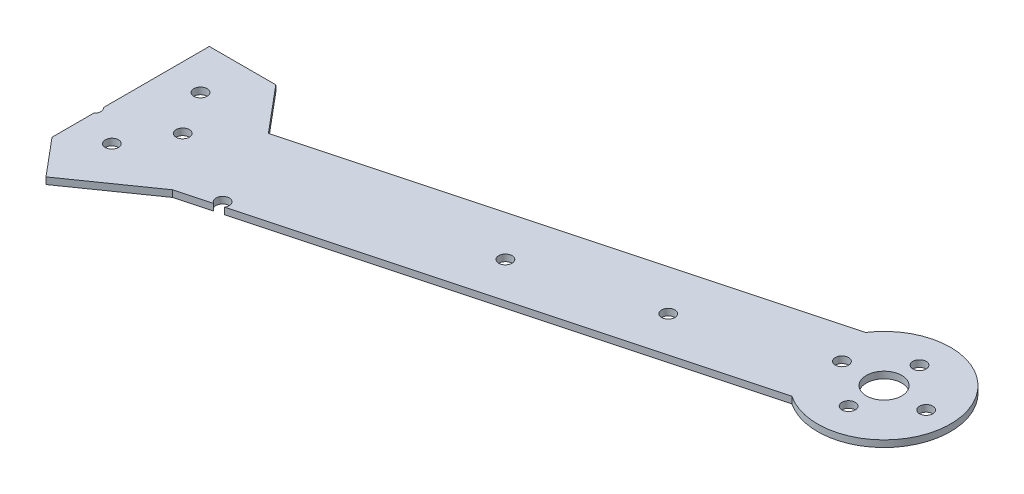
ISO-10303-21;
HEADER;
FILE_DESCRIPTION(('STEP AP214'),'2;1');
FILE_NAME('part.step','',(''),(''),'','','');
FILE_SCHEMA(('AUTOMOTIVE_DESIGN { 1 0 10303 214 1 1 1 1 }'));
ENDSEC;
DATA;
#1=APPLICATION_CONTEXT('core data for automotive mechanical design processes');
#2=APPLICATION_PROTOCOL_DEFINITION('international standard','automotive_design',2000,#1);
#3=PRODUCT_CONTEXT('',#1,'mechanical');
#4=PRODUCT('Part','Part','',(#3));
#5=PRODUCT_RELATED_PRODUCT_CATEGORY('part','',(#4));
#6=PRODUCT_DEFINITION_FORMATION('','',#4);
#7=PRODUCT_DEFINITION_CONTEXT('part definition',#1,'design');
#8=PRODUCT_DEFINITION('design','',#6,#7);
#9=PRODUCT_DEFINITION_SHAPE('','',#8);
#10=(LENGTH_UNIT() NAMED_UNIT(*) SI_UNIT(.MILLI.,.METRE.));
#11=(NAMED_UNIT(*) PLANE_ANGLE_UNIT() SI_UNIT($,.RADIAN.));
#12=(NAMED_UNIT(*) SI_UNIT($,.STERADIAN.) SOLID_ANGLE_UNIT());
#13=UNCERTAINTY_MEASURE_WITH_UNIT(LENGTH_MEASURE(1.E-05),#10,'distance_accuracy_value','');
#14=(GEOMETRIC_REPRESENTATION_CONTEXT(3) GLOBAL_UNCERTAINTY_ASSIGNED_CONTEXT((#13)) GLOBAL_UNIT_ASSIGNED_CONTEXT((#10,
#11,#12)) REPRESENTATION_CONTEXT('',''));
#15=CARTESIAN_POINT('',(0.,0.,0.));
#16=DIRECTION('',(0.,0.,1.));
#17=DIRECTION('',(1.,0.,0.));
#18=AXIS2_PLACEMENT_3D('',#15,#16,#17);
#19=CARTESIAN_POINT('',(0.765157013757434,1.5,2.85613868994704));
#20=DIRECTION('',(-0.258773909128812,0.,-0.965937919306512));
#21=DIRECTION('',(-0.965937919306512,0.,0.258773909128812));
#22=AXIS2_PLACEMENT_3D('',#19,#20,#21);
#23=PLANE('',#22);
#24=DIRECTION('',(0.965937919306512,0.,-0.258773909128812));
#25=VECTOR('',#24,1.);
#26=CARTESIAN_POINT('',(0.765157013757434,0.,2.85613868994704));
#27=LINE('',#26,#25);
#28=CARTESIAN_POINT('',(23.8632806144762,0.,-3.33182807088762));
#29=VERTEX_POINT('',#28);
#30=CARTESIAN_POINT('',(31.1943125351646,0.,-5.29580499957743));
#31=VERTEX_POINT('',#30);
#32=EDGE_CURVE('E215',#29,#31,#27,.T.);
#33=ORIENTED_EDGE('',*,*,#32,.T.);
#34=DIRECTION('',(0.,1.,0.));
#35=VECTOR('',#34,1.);
#36=CARTESIAN_POINT('',(31.1943125351646,-4.2426406871193,-5.29580499957743));
#37=LINE('',#36,#35);
#38=CARTESIAN_POINT('',(31.1943125351646,1.5,-5.29580499957743));
#39=VERTEX_POINT('',#38);
#40=EDGE_CURVE('E59',#31,#39,#37,.T.);
#41=ORIENTED_EDGE('',*,*,#40,.T.);
#42=DIRECTION('',(0.965937919306512,0.,-0.258773909128812));
#43=VECTOR('',#42,1.);
#44=CARTESIAN_POINT('',(0.765157013757434,1.5,2.85613868994704));
#45=LINE('',#44,#43);
#46=CARTESIAN_POINT('',(23.8632806144762,1.5,-3.33182807088762));
#47=VERTEX_POINT('',#46);
#48=EDGE_CURVE('E368',#47,#39,#45,.T.);
#49=ORIENTED_EDGE('',*,*,#48,.F.);
#50=DIRECTION('',(0.,-1.,0.));
#51=VECTOR('',#50,1.);
#52=CARTESIAN_POINT('',(23.8632806144762,1.5,-3.33182807088762));
#53=LINE('',#52,#51);
#54=EDGE_CURVE('E266',#47,#29,#53,.T.);
#55=ORIENTED_EDGE('',*,*,#54,.T.);
#56=EDGE_LOOP('',(#33,#41,#49,#55));
#57=FACE_BOUND('',#56,.T.);
#58=ADVANCED_FACE('F43',(#57),#23,.F.);
#59=CARTESIAN_POINT('',(-0.999999999999998,1.5,-10.5));
#60=DIRECTION('',(0.,-1.,0.));
#61=DIRECTION('',(0.,0.,-1.));
#62=AXIS2_PLACEMENT_3D('',#59,#60,#61);
#63=CYLINDRICAL_SURFACE('',#62,1.5);
#64=CARTESIAN_POINT('',(-0.999999999999998,0.,-10.5));
#65=DIRECTION('',(0.,1.,0.));
#66=DIRECTION('',(0.,0.,1.));
#67=AXIS2_PLACEMENT_3D('',#64,#65,#66);
#68=CIRCLE('',#67,1.5);
#69=CARTESIAN_POINT('',(0.,0.,-9.3819660112501));
#70=VERTEX_POINT('',#69);
#71=CARTESIAN_POINT('',(0.,0.,-11.6180339887499));
#72=VERTEX_POINT('',#71);
#73=EDGE_CURVE('E199',#70,#72,#68,.T.);
#74=ORIENTED_EDGE('',*,*,#73,.F.);
#75=DIRECTION('',(0.,-1.,0.));
#76=VECTOR('',#75,1.);
#77=CARTESIAN_POINT('',(0.,1.5,-9.3819660112501));
#78=LINE('',#77,#76);
#79=CARTESIAN_POINT('',(0.,1.5,-9.3819660112501));
#80=VERTEX_POINT('',#79);
#81=EDGE_CURVE('E11',#80,#70,#78,.T.);
#82=ORIENTED_EDGE('',*,*,#81,.F.);
#83=CARTESIAN_POINT('',(-0.999999999999998,1.5,-10.5));
#84=DIRECTION('',(0.,1.,0.));
#85=DIRECTION('',(0.,0.,1.));
#86=AXIS2_PLACEMENT_3D('',#83,#84,#85);
#87=CIRCLE('',#86,1.5);
#88=CARTESIAN_POINT('',(0.,1.5,-11.6180339887499));
#89=VERTEX_POINT('',#88);
#90=EDGE_CURVE('E357',#80,#89,#87,.T.);
#91=ORIENTED_EDGE('',*,*,#90,.T.);
#92=DIRECTION('',(0.,-1.,0.));
#93=VECTOR('',#92,1.);
#94=CARTESIAN_POINT('',(0.,1.5,-11.6180339887499));
#95=LINE('',#94,#93);
#96=EDGE_CURVE('E68',#89,#72,#95,.T.);
#97=ORIENTED_EDGE('',*,*,#96,.T.);
#98=EDGE_LOOP('',(#74,#82,#91,#97));
#99=FACE_BOUND('',#98,.T.);
#100=ADVANCED_FACE('F291',(#99),#63,.F.);
#101=CARTESIAN_POINT('',(0.,1.5,0.));
#102=DIRECTION('',(-1.,0.,0.));
#103=DIRECTION('',(0.,0.,1.));
#104=AXIS2_PLACEMENT_3D('',#101,#102,#103);
#105=PLANE('',#104);
#106=DIRECTION('',(0.,0.,-1.));
#107=VECTOR('',#106,1.);
#108=CARTESIAN_POINT('',(0.,0.,0.));
#109=LINE('',#108,#107);
#110=CARTESIAN_POINT('',(0.,0.,0.));
#111=VERTEX_POINT('',#110);
#112=EDGE_CURVE('E202',#111,#70,#109,.T.);
#113=ORIENTED_EDGE('',*,*,#112,.F.);
#114=DIRECTION('',(0.,-1.,0.));
#115=VECTOR('',#114,1.);
#116=CARTESIAN_POINT('',(0.,1.5,0.));
#117=LINE('',#116,#115);
#118=CARTESIAN_POINT('',(0.,1.5,0.));
#119=VERTEX_POINT('',#118);
#120=EDGE_CURVE('E52',#119,#111,#117,.T.);
#121=ORIENTED_EDGE('',*,*,#120,.F.);
#122=DIRECTION('',(0.,0.,-1.));
#123=VECTOR('',#122,1.);
#124=CARTESIAN_POINT('',(0.,1.5,0.));
#125=LINE('',#124,#123);
#126=EDGE_CURVE('E290',#119,#80,#125,.T.);
#127=ORIENTED_EDGE('',*,*,#126,.T.);
#128=ORIENTED_EDGE('',*,*,#81,.T.);
#129=EDGE_LOOP('',(#113,#121,#127,#128));
#130=FACE_BOUND('',#129,.T.);
#131=ADVANCED_FACE('F289',(#130),#105,.T.);
#132=CARTESIAN_POINT('',(0.,1.5,0.));
#133=DIRECTION('',(0.766044443118982,0.,-0.642787609686535));
#134=DIRECTION('',(-0.642787609686535,0.,-0.766044443118982));
#135=AXIS2_PLACEMENT_3D('',#132,#133,#134);
#136=PLANE('',#135);
#137=DIRECTION('',(0.642787609686535,0.,0.766044443118982));
#138=VECTOR('',#137,1.);
#139=CARTESIAN_POINT('',(0.,0.,0.));
#140=LINE('',#139,#138);
#141=CARTESIAN_POINT('',(7.07066370655189,0.,8.4264888743088));
#142=VERTEX_POINT('',#141);
#143=EDGE_CURVE('E206',#111,#142,#140,.T.);
#144=ORIENTED_EDGE('',*,*,#143,.T.);
#145=DIRECTION('',(0.,-1.,0.));
#146=VECTOR('',#145,1.);
#147=CARTESIAN_POINT('',(7.07066370655189,1.5,8.4264888743088));
#148=LINE('',#147,#146);
#149=CARTESIAN_POINT('',(7.07066370655189,1.5,8.4264888743088));
#150=VERTEX_POINT('',#149);
#151=EDGE_CURVE('E270',#150,#142,#148,.T.);
#152=ORIENTED_EDGE('',*,*,#151,.F.);
#153=DIRECTION('',(0.642787609686535,0.,0.766044443118982));
#154=VECTOR('',#153,1.);
#155=CARTESIAN_POINT('',(0.,1.5,0.));
#156=LINE('',#155,#154);
#157=EDGE_CURVE('E280',#119,#150,#156,.T.);
#158=ORIENTED_EDGE('',*,*,#157,.F.);
#159=ORIENTED_EDGE('',*,*,#120,.T.);
#160=EDGE_LOOP('',(#144,#152,#158,#159));
#161=FACE_BOUND('',#160,.T.);
#162=ADVANCED_FACE('F277',(#161),#136,.F.);
#163=CARTESIAN_POINT('',(6.28533185327595,1.5,8.97638415796881));
#164=DIRECTION('',(-0.573576436351045,0.,-0.819152044288993));
#165=DIRECTION('',(-0.819152044288993,0.,0.573576436351045));
#166=AXIS2_PLACEMENT_3D('',#163,#164,#165);
#167=PLANE('',#166);
#168=DIRECTION('',(0.819152044288993,0.,-0.573576436351045));
#169=VECTOR('',#168,1.);
#170=CARTESIAN_POINT('',(6.28533185327595,0.,8.97638415796881));
#171=LINE('',#170,#169);
#172=EDGE_CURVE('E210',#142,#29,#171,.T.);
#173=ORIENTED_EDGE('',*,*,#172,.T.);
#174=ORIENTED_EDGE('',*,*,#54,.F.);
#175=DIRECTION('',(0.819152044288993,0.,-0.573576436351045));
#176=VECTOR('',#175,1.);
#177=CARTESIAN_POINT('',(6.28533185327595,1.5,8.97638415796881));
#178=LINE('',#177,#176);
#179=EDGE_CURVE('E364',#150,#47,#178,.T.);
#180=ORIENTED_EDGE('',*,*,#179,.F.);
#181=ORIENTED_EDGE('',*,*,#151,.T.);
#182=EDGE_LOOP('',(#173,#174,#180,#181));
#183=FACE_BOUND('',#182,.T.);
#184=ADVANCED_FACE('F380',(#183),#167,.F.);
#185=CARTESIAN_POINT('',(33.1085220639019,1.5,-5.80862002913812));
#186=VERTEX_POINT('',#185);
#187=CARTESIAN_POINT('',(134.097880355283,1.5,-32.8635792590577));
#188=VERTEX_POINT('',#187);
#189=EDGE_CURVE('E308',#186,#188,#45,.T.);
#190=ORIENTED_EDGE('',*,*,#189,.F.);
#191=DIRECTION('',(0.,1.,0.));
#192=VECTOR('',#191,1.);
#193=CARTESIAN_POINT('',(33.1085220639018,-4.2426406871193,-5.80862002913812));
#194=LINE('',#193,#192);
#195=CARTESIAN_POINT('',(33.1085220639019,0.,-5.80862002913812));
#196=VERTEX_POINT('',#195);
#197=EDGE_CURVE('E311',#186,#196,#194,.F.);
#198=ORIENTED_EDGE('',*,*,#197,.T.);
#199=CARTESIAN_POINT('',(134.097880355283,0.,-32.8635792590577));
#200=VERTEX_POINT('',#199);
#201=EDGE_CURVE('E214',#196,#200,#27,.T.);
#202=ORIENTED_EDGE('',*,*,#201,.T.);
#203=DIRECTION('',(0.,-1.,0.));
#204=VECTOR('',#203,1.);
#205=CARTESIAN_POINT('',(134.097880355283,1.5,-32.8635792590577));
#206=LINE('',#205,#204);
#207=EDGE_CURVE('E262',#188,#200,#206,.T.);
#208=ORIENTED_EDGE('',*,*,#207,.F.);
#209=EDGE_LOOP('',(#190,#198,#202,#208));
#210=FACE_BOUND('',#209,.T.);
#211=ADVANCED_FACE('F305',(#210),#23,.F.);
#212=CARTESIAN_POINT('',(142.429473622566,1.5,-45.3369330032826));
#213=DIRECTION('',(0.,-1.,0.));
#214=DIRECTION('',(0.,0.,-1.));
#215=AXIS2_PLACEMENT_3D('',#212,#213,#214);
#216=CYLINDRICAL_SURFACE('',#215,15.);
#217=CARTESIAN_POINT('',(142.429473622566,0.,-45.3369330032826));
#218=DIRECTION('',(0.,1.,0.));
#219=DIRECTION('',(0.,0.,1.));
#220=AXIS2_PLACEMENT_3D('',#217,#218,#219);
#221=CIRCLE('',#220,15.);
#222=CARTESIAN_POINT('',(129.929473622566,0.,-53.6284949791711));
#223=VERTEX_POINT('',#222);
#224=EDGE_CURVE('E219',#200,#223,#221,.T.);
#225=ORIENTED_EDGE('',*,*,#224,.T.);
#226=DIRECTION('',(0.,-1.,0.));
#227=VECTOR('',#226,1.);
#228=CARTESIAN_POINT('',(129.929473622566,1.5,-53.6284949791711));
#229=LINE('',#228,#227);
#230=CARTESIAN_POINT('',(129.929473622566,1.5,-53.6284949791711));
#231=VERTEX_POINT('',#230);
#232=EDGE_CURVE('E259',#231,#223,#229,.T.);
#233=ORIENTED_EDGE('',*,*,#232,.F.);
#234=CARTESIAN_POINT('',(142.429473622566,1.5,-45.3369330032826));
#235=DIRECTION('',(0.,1.,0.));
#236=DIRECTION('',(0.,0.,1.));
#237=AXIS2_PLACEMENT_3D('',#234,#235,#236);
#238=CIRCLE('',#237,15.);
#239=EDGE_CURVE('E302',#188,#231,#238,.T.);
#240=ORIENTED_EDGE('',*,*,#239,.F.);
#241=ORIENTED_EDGE('',*,*,#207,.T.);
#242=EDGE_LOOP('',(#225,#233,#240,#241));
#243=FACE_BOUND('',#242,.T.);
#244=ADVANCED_FACE('F300',(#243),#216,.T.);
#245=CARTESIAN_POINT('',(-4.70349936225093,1.5,-17.5536985932882));
#246=DIRECTION('',(-0.258819045102521,0.,-0.965925826289068));
#247=DIRECTION('',(-0.965925826289068,0.,0.258819045102521));
#248=AXIS2_PLACEMENT_3D('',#245,#246,#247);
#249=PLANE('',#248);
#250=DIRECTION('',(0.965925826289068,0.,-0.258819045102521));
#251=VECTOR('',#250,1.);
#252=CARTESIAN_POINT('',(-4.70349936225093,0.,-17.5536985932882));
#253=LINE('',#252,#251);
#254=CARTESIAN_POINT('',(23.6776327307683,0.,-25.1584000178938));
#255=VERTEX_POINT('',#254);
#256=EDGE_CURVE('E223',#255,#223,#253,.T.);
#257=ORIENTED_EDGE('',*,*,#256,.F.);
#258=DIRECTION('',(0.,-1.,0.));
#259=VECTOR('',#258,1.);
#260=CARTESIAN_POINT('',(23.6776327307683,1.5,-25.1584000178938));
#261=LINE('',#260,#259);
#262=CARTESIAN_POINT('',(23.6776327307683,1.5,-25.1584000178938));
#263=VERTEX_POINT('',#262);
#264=EDGE_CURVE('E144',#263,#255,#261,.T.);
#265=ORIENTED_EDGE('',*,*,#264,.F.);
#266=DIRECTION('',(0.965925826289068,0.,-0.258819045102521));
#267=VECTOR('',#266,1.);
#268=CARTESIAN_POINT('',(-4.70349936225093,1.5,-17.5536985932882));
#269=LINE('',#268,#267);
#270=EDGE_CURVE('E156',#263,#231,#269,.T.);
#271=ORIENTED_EDGE('',*,*,#270,.T.);
#272=ORIENTED_EDGE('',*,*,#232,.T.);
#273=EDGE_LOOP('',(#257,#265,#271,#272));
#274=FACE_BOUND('',#273,.T.);
#275=ADVANCED_FACE('F296',(#274),#249,.T.);
#276=CARTESIAN_POINT('',(26.2826989484687,1.5,-22.0538029940035));
#277=DIRECTION('',(0.76604444311898,0.,-0.642787609686537));
#278=DIRECTION('',(-0.642787609686537,0.,-0.76604444311898));
#279=AXIS2_PLACEMENT_3D('',#276,#277,#278);
#280=PLANE('',#279);
#281=DIRECTION('',(0.642787609686537,0.,0.76604444311898));
#282=VECTOR('',#281,1.);
#283=CARTESIAN_POINT('',(26.2826989484687,0.,-22.0538029940035));
#284=LINE('',#283,#282);
#285=CARTESIAN_POINT('',(15.,0.,-35.5));
#286=VERTEX_POINT('',#285);
#287=EDGE_CURVE('E138',#286,#255,#284,.T.);
#288=ORIENTED_EDGE('',*,*,#287,.F.);
#289=DIRECTION('',(0.,-1.,0.));
#290=VECTOR('',#289,1.);
#291=CARTESIAN_POINT('',(15.,1.5,-35.5));
#292=LINE('',#291,#290);
#293=CARTESIAN_POINT('',(15.,1.5,-35.5));
#294=VERTEX_POINT('',#293);
#295=EDGE_CURVE('E133',#294,#286,#292,.T.);
#296=ORIENTED_EDGE('',*,*,#295,.F.);
#297=DIRECTION('',(0.642787609686537,0.,0.76604444311898));
#298=VECTOR('',#297,1.);
#299=CARTESIAN_POINT('',(26.2826989484687,1.5,-22.0538029940035));
#300=LINE('',#299,#298);
#301=EDGE_CURVE('E136',#294,#263,#300,.T.);
#302=ORIENTED_EDGE('',*,*,#301,.T.);
#303=ORIENTED_EDGE('',*,*,#264,.T.);
#304=EDGE_LOOP('',(#288,#296,#302,#303));
#305=FACE_BOUND('',#304,.T.);
#306=ADVANCED_FACE('F135',(#305),#280,.T.);
#307=CARTESIAN_POINT('',(0.,1.5,-35.5));
#308=DIRECTION('',(0.,0.,-1.));
#309=DIRECTION('',(-1.,0.,0.));
#310=AXIS2_PLACEMENT_3D('',#307,#308,#309);
#311=PLANE('',#310);
#312=DIRECTION('',(1.,0.,0.));
#313=VECTOR('',#312,1.);
#314=CARTESIAN_POINT('',(0.,0.,-35.5));
#315=LINE('',#314,#313);
#316=CARTESIAN_POINT('',(0.,0.,-35.5));
#317=VERTEX_POINT('',#316);
#318=EDGE_CURVE('E229',#317,#286,#315,.T.);
#319=ORIENTED_EDGE('',*,*,#318,.F.);
#320=DIRECTION('',(0.,-1.,0.));
#321=VECTOR('',#320,1.);
#322=CARTESIAN_POINT('',(0.,1.5,-35.5));
#323=LINE('',#322,#321);
#324=CARTESIAN_POINT('',(0.,1.5,-35.5));
#325=VERTEX_POINT('',#324);
#326=EDGE_CURVE('E145',#325,#317,#323,.T.);
#327=ORIENTED_EDGE('',*,*,#326,.F.);
#328=DIRECTION('',(1.,0.,0.));
#329=VECTOR('',#328,1.);
#330=CARTESIAN_POINT('',(0.,1.5,-35.5));
#331=LINE('',#330,#329);
#332=EDGE_CURVE('E154',#325,#294,#331,.T.);
#333=ORIENTED_EDGE('',*,*,#332,.T.);
#334=ORIENTED_EDGE('',*,*,#295,.T.);
#335=EDGE_LOOP('',(#319,#327,#333,#334));
#336=FACE_BOUND('',#335,.T.);
#337=ADVANCED_FACE('F159',(#336),#311,.T.);
#338=CARTESIAN_POINT('',(8.,1.5,-25.5));
#339=DIRECTION('',(0.,-1.,0.));
#340=DIRECTION('',(0.,0.,-1.));
#341=AXIS2_PLACEMENT_3D('',#338,#339,#340);
#342=CYLINDRICAL_SURFACE('',#341,1.5);
#343=CARTESIAN_POINT('',(8.,1.5,-25.5));
#344=DIRECTION('',(0.,1.,0.));
#345=DIRECTION('',(0.,0.,1.));
#346=AXIS2_PLACEMENT_3D('',#343,#344,#345);
#347=CIRCLE('',#346,1.5);
#348=CARTESIAN_POINT('',(8.,1.5,-24.));
#349=VERTEX_POINT('',#348);
#350=EDGE_CURVE('E175',#349,#349,#347,.T.);
#351=ORIENTED_EDGE('',*,*,#350,.T.);
#352=EDGE_LOOP('',(#351));
#353=FACE_BOUND('',#352,.T.);
#354=CARTESIAN_POINT('',(8.,0.,-25.5));
#355=DIRECTION('',(0.,1.,0.));
#356=DIRECTION('',(0.,0.,1.));
#357=AXIS2_PLACEMENT_3D('',#354,#355,#356);
#358=CIRCLE('',#357,1.5);
#359=CARTESIAN_POINT('',(8.,0.,-24.));
#360=VERTEX_POINT('',#359);
#361=EDGE_CURVE('E244',#360,#360,#358,.T.);
#362=ORIENTED_EDGE('',*,*,#361,.F.);
#363=EDGE_LOOP('',(#362));
#364=FACE_BOUND('',#363,.T.);
#365=ADVANCED_FACE('F403',(#353,#364),#342,.F.);
#366=CARTESIAN_POINT('',(14.,1.5,-15.5));
#367=DIRECTION('',(0.,-1.,0.));
#368=DIRECTION('',(0.,0.,-1.));
#369=AXIS2_PLACEMENT_3D('',#366,#367,#368);
#370=CYLINDRICAL_SURFACE('',#369,1.5);
#371=CARTESIAN_POINT('',(14.,1.5,-15.5));
#372=DIRECTION('',(0.,1.,0.));
#373=DIRECTION('',(0.,0.,1.));
#374=AXIS2_PLACEMENT_3D('',#371,#372,#373);
#375=CIRCLE('',#374,1.5);
#376=CARTESIAN_POINT('',(14.,1.5,-14.));
#377=VERTEX_POINT('',#376);
#378=EDGE_CURVE('E171',#377,#377,#375,.T.);
#379=ORIENTED_EDGE('',*,*,#378,.T.);
#380=EDGE_LOOP('',(#379));
#381=FACE_BOUND('',#380,.T.);
#382=CARTESIAN_POINT('',(14.,0.,-15.5));
#383=DIRECTION('',(0.,1.,0.));
#384=DIRECTION('',(0.,0.,1.));
#385=AXIS2_PLACEMENT_3D('',#382,#383,#384);
#386=CIRCLE('',#385,1.5);
#387=CARTESIAN_POINT('',(14.,0.,-14.));
#388=VERTEX_POINT('',#387);
#389=EDGE_CURVE('E240',#388,#388,#386,.T.);
#390=ORIENTED_EDGE('',*,*,#389,.F.);
#391=EDGE_LOOP('',(#390));
#392=FACE_BOUND('',#391,.T.);
#393=ADVANCED_FACE('F410',(#381,#392),#370,.F.);
#394=CARTESIAN_POINT('',(8.,1.5,-5.5));
#395=DIRECTION('',(0.,-1.,0.));
#396=DIRECTION('',(0.,0.,-1.));
#397=AXIS2_PLACEMENT_3D('',#394,#395,#396);
#398=CYLINDRICAL_SURFACE('',#397,1.5);
#399=CARTESIAN_POINT('',(8.,1.5,-5.5));
#400=DIRECTION('',(0.,1.,0.));
#401=DIRECTION('',(0.,0.,1.));
#402=AXIS2_PLACEMENT_3D('',#399,#400,#401);
#403=CIRCLE('',#402,1.5);
#404=CARTESIAN_POINT('',(8.,1.5,-4.));
#405=VERTEX_POINT('',#404);
#406=EDGE_CURVE('E164',#405,#405,#403,.T.);
#407=ORIENTED_EDGE('',*,*,#406,.T.);
#408=EDGE_LOOP('',(#407));
#409=FACE_BOUND('',#408,.T.);
#410=CARTESIAN_POINT('',(8.,0.,-5.5));
#411=DIRECTION('',(0.,1.,0.));
#412=DIRECTION('',(0.,0.,1.));
#413=AXIS2_PLACEMENT_3D('',#410,#411,#412);
#414=CIRCLE('',#413,1.5);
#415=CARTESIAN_POINT('',(8.,0.,-4.));
#416=VERTEX_POINT('',#415);
#417=EDGE_CURVE('E236',#416,#416,#414,.T.);
#418=ORIENTED_EDGE('',*,*,#417,.F.);
#419=EDGE_LOOP('',(#418));
#420=FACE_BOUND('',#419,.T.);
#421=ADVANCED_FACE('F407',(#409,#420),#398,.F.);
#422=CARTESIAN_POINT('',(0.,1.5,0.));
#423=DIRECTION('',(-1.,0.,0.));
#424=DIRECTION('',(0.,0.,1.));
#425=AXIS2_PLACEMENT_3D('',#422,#423,#424);
#426=PLANE('',#425);
#427=DIRECTION('',(0.,0.,-1.));
#428=VECTOR('',#427,1.);
#429=CARTESIAN_POINT('',(0.,0.,0.));
#430=LINE('',#429,#428);
#431=EDGE_CURVE('E232',#72,#317,#430,.T.);
#432=ORIENTED_EDGE('',*,*,#431,.F.);
#433=ORIENTED_EDGE('',*,*,#96,.F.);
#434=DIRECTION('',(0.,0.,-1.));
#435=VECTOR('',#434,1.);
#436=CARTESIAN_POINT('',(0.,1.5,0.));
#437=LINE('',#436,#435);
#438=EDGE_CURVE('E161',#89,#325,#437,.T.);
#439=ORIENTED_EDGE('',*,*,#438,.T.);
#440=ORIENTED_EDGE('',*,*,#326,.T.);
#441=EDGE_LOOP('',(#432,#433,#439,#440));
#442=FACE_BOUND('',#441,.T.);
#443=ADVANCED_FACE('F292',(#442),#426,.T.);
#444=CARTESIAN_POINT('',(142.429473622566,1.5,-53.3369330032827));
#445=DIRECTION('',(0.,-1.,0.));
#446=DIRECTION('',(0.,0.,-1.));
#447=AXIS2_PLACEMENT_3D('',#444,#445,#446);
#448=CYLINDRICAL_SURFACE('',#447,1.5);
#449=CARTESIAN_POINT('',(142.429473622566,1.5,-53.3369330032827));
#450=DIRECTION('',(0.,1.,0.));
#451=DIRECTION('',(0.,0.,1.));
#452=AXIS2_PLACEMENT_3D('',#449,#450,#451);
#453=CIRCLE('',#452,1.5);
#454=CARTESIAN_POINT('',(142.429473622566,1.5,-51.8369330032827));
#455=VERTEX_POINT('',#454);
#456=EDGE_CURVE('E353',#455,#455,#453,.T.);
#457=ORIENTED_EDGE('',*,*,#456,.T.);
#458=EDGE_LOOP('',(#457));
#459=FACE_BOUND('',#458,.T.);
#460=CARTESIAN_POINT('',(142.429473622566,0.,-53.3369330032827));
#461=DIRECTION('',(0.,1.,0.));
#462=DIRECTION('',(0.,0.,1.));
#463=AXIS2_PLACEMENT_3D('',#460,#461,#462);
#464=CIRCLE('',#463,1.5);
#465=CARTESIAN_POINT('',(142.429473622566,0.,-51.8369330032827));
#466=VERTEX_POINT('',#465);
#467=EDGE_CURVE('E195',#466,#466,#464,.T.);
#468=ORIENTED_EDGE('',*,*,#467,.F.);
#469=EDGE_LOOP('',(#468));
#470=FACE_BOUND('',#469,.T.);
#471=ADVANCED_FACE('F406',(#459,#470),#448,.F.);
#472=CARTESIAN_POINT('',(151.929473622566,1.5,-45.3369330032826));
#473=DIRECTION('',(0.,-1.,0.));
#474=DIRECTION('',(0.,0.,-1.));
#475=AXIS2_PLACEMENT_3D('',#472,#473,#474);
#476=CYLINDRICAL_SURFACE('',#475,1.5);
#477=CARTESIAN_POINT('',(151.929473622566,1.5,-45.3369330032826));
#478=DIRECTION('',(0.,1.,0.));
#479=DIRECTION('',(0.,0.,1.));
#480=AXIS2_PLACEMENT_3D('',#477,#478,#479);
#481=CIRCLE('',#480,1.5);
#482=CARTESIAN_POINT('',(151.929473622566,1.5,-43.8369330032826));
#483=VERTEX_POINT('',#482);
#484=EDGE_CURVE('E349',#483,#483,#481,.T.);
#485=ORIENTED_EDGE('',*,*,#484,.T.);
#486=EDGE_LOOP('',(#485));
#487=FACE_BOUND('',#486,.T.);
#488=CARTESIAN_POINT('',(151.929473622566,0.,-45.3369330032826));
#489=DIRECTION('',(0.,1.,0.));
#490=DIRECTION('',(0.,0.,1.));
#491=AXIS2_PLACEMENT_3D('',#488,#489,#490);
#492=CIRCLE('',#491,1.5);
#493=CARTESIAN_POINT('',(151.929473622566,0.,-43.8369330032826));
#494=VERTEX_POINT('',#493);
#495=EDGE_CURVE('E191',#494,#494,#492,.T.);
#496=ORIENTED_EDGE('',*,*,#495,.F.);
#497=EDGE_LOOP('',(#496));
#498=FACE_BOUND('',#497,.T.);
#499=ADVANCED_FACE('F455',(#487,#498),#476,.F.);
#500=CARTESIAN_POINT('',(142.429473622566,1.5,-37.3369330032827));
#501=DIRECTION('',(0.,-1.,0.));
#502=DIRECTION('',(0.,0.,-1.));
#503=AXIS2_PLACEMENT_3D('',#500,#501,#502);
#504=CYLINDRICAL_SURFACE('',#503,1.5);
#505=CARTESIAN_POINT('',(142.429473622566,1.5,-37.3369330032827));
#506=DIRECTION('',(0.,1.,0.));
#507=DIRECTION('',(0.,0.,1.));
#508=AXIS2_PLACEMENT_3D('',#505,#506,#507);
#509=CIRCLE('',#508,1.5);
#510=CARTESIAN_POINT('',(142.429473622566,1.5,-35.8369330032827));
#511=VERTEX_POINT('',#510);
#512=EDGE_CURVE('E345',#511,#511,#509,.T.);
#513=ORIENTED_EDGE('',*,*,#512,.T.);
#514=EDGE_LOOP('',(#513));
#515=FACE_BOUND('',#514,.T.);
#516=CARTESIAN_POINT('',(142.429473622566,0.,-37.3369330032827));
#517=DIRECTION('',(0.,1.,0.));
#518=DIRECTION('',(0.,0.,1.));
#519=AXIS2_PLACEMENT_3D('',#516,#517,#518);
#520=CIRCLE('',#519,1.5);
#521=CARTESIAN_POINT('',(142.429473622566,0.,-35.8369330032827));
#522=VERTEX_POINT('',#521);
#523=EDGE_CURVE('E187',#522,#522,#520,.T.);
#524=ORIENTED_EDGE('',*,*,#523,.F.);
#525=EDGE_LOOP('',(#524));
#526=FACE_BOUND('',#525,.T.);
#527=ADVANCED_FACE('F461',(#515,#526),#504,.F.);
#528=CARTESIAN_POINT('',(132.929473622566,1.5,-45.3369330032826));
#529=DIRECTION('',(0.,-1.,0.));
#530=DIRECTION('',(0.,0.,-1.));
#531=AXIS2_PLACEMENT_3D('',#528,#529,#530);
#532=CYLINDRICAL_SURFACE('',#531,1.5);
#533=CARTESIAN_POINT('',(132.929473622566,1.5,-45.3369330032826));
#534=DIRECTION('',(0.,1.,0.));
#535=DIRECTION('',(0.,0.,1.));
#536=AXIS2_PLACEMENT_3D('',#533,#534,#535);
#537=CIRCLE('',#536,1.5);
#538=CARTESIAN_POINT('',(132.929473622566,1.5,-43.8369330032826));
#539=VERTEX_POINT('',#538);
#540=EDGE_CURVE('E252',#539,#539,#537,.T.);
#541=ORIENTED_EDGE('',*,*,#540,.T.);
#542=EDGE_LOOP('',(#541));
#543=FACE_BOUND('',#542,.T.);
#544=CARTESIAN_POINT('',(132.929473622566,0.,-45.3369330032826));
#545=DIRECTION('',(0.,1.,0.));
#546=DIRECTION('',(0.,0.,1.));
#547=AXIS2_PLACEMENT_3D('',#544,#545,#546);
#548=CIRCLE('',#547,1.5);
#549=CARTESIAN_POINT('',(132.929473622566,0.,-43.8369330032826));
#550=VERTEX_POINT('',#549);
#551=EDGE_CURVE('E183',#550,#550,#548,.T.);
#552=ORIENTED_EDGE('',*,*,#551,.F.);
#553=EDGE_LOOP('',(#552));
#554=FACE_BOUND('',#553,.T.);
#555=ADVANCED_FACE('F45',(#543,#554),#532,.F.);
#556=CARTESIAN_POINT('',(142.429473622566,1.5,-45.3369330032826));
#557=DIRECTION('',(0.,-1.,0.));
#558=DIRECTION('',(0.,0.,-1.));
#559=AXIS2_PLACEMENT_3D('',#556,#557,#558);
#560=CYLINDRICAL_SURFACE('',#559,4.00000000000002);
#561=CARTESIAN_POINT('',(142.429473622566,1.5,-45.3369330032826));
#562=DIRECTION('',(0.,1.,0.));
#563=DIRECTION('',(0.,0.,1.));
#564=AXIS2_PLACEMENT_3D('',#561,#562,#563);
#565=CIRCLE('',#564,4.00000000000002);
#566=CARTESIAN_POINT('',(142.429473622566,1.5,-41.3369330032826));
#567=VERTEX_POINT('',#566);
#568=EDGE_CURVE('E179',#567,#567,#565,.T.);
#569=ORIENTED_EDGE('',*,*,#568,.T.);
#570=EDGE_LOOP('',(#569));
#571=FACE_BOUND('',#570,.T.);
#572=CARTESIAN_POINT('',(142.429473622566,0.,-45.3369330032826));
#573=DIRECTION('',(0.,1.,0.));
#574=DIRECTION('',(0.,0.,1.));
#575=AXIS2_PLACEMENT_3D('',#572,#573,#574);
#576=CIRCLE('',#575,4.00000000000002);
#577=CARTESIAN_POINT('',(142.429473622566,0.,-41.3369330032826));
#578=VERTEX_POINT('',#577);
#579=EDGE_CURVE('E248',#578,#578,#576,.T.);
#580=ORIENTED_EDGE('',*,*,#579,.F.);
#581=EDGE_LOOP('',(#580));
#582=FACE_BOUND('',#581,.T.);
#583=ADVANCED_FACE('F418',(#571,#582),#560,.F.);
#584=CARTESIAN_POINT('',(0.,1.5,0.));
#585=DIRECTION('',(0.,1.,0.));
#586=DIRECTION('',(0.,0.,1.));
#587=AXIS2_PLACEMENT_3D('',#584,#585,#586);
#588=PLANE('',#587);
#589=CARTESIAN_POINT('',(75.0373410971955,1.5,-27.2792655168984));
#590=DIRECTION('',(0.,1.,0.));
#591=DIRECTION('',(0.,0.,1.));
#592=AXIS2_PLACEMENT_3D('',#589,#590,#591);
#593=CIRCLE('',#592,1.5);
#594=CARTESIAN_POINT('',(75.0373410971955,1.5,-25.7792655168984));
#595=VERTEX_POINT('',#594);
#596=EDGE_CURVE('E327',#595,#595,#593,.T.);
#597=ORIENTED_EDGE('',*,*,#596,.F.);
#598=EDGE_LOOP('',(#597));
#599=FACE_BOUND('',#598,.T.);
#600=CARTESIAN_POINT('',(104.015115885868,1.5,-35.0438368699741));
#601=DIRECTION('',(0.,1.,0.));
#602=DIRECTION('',(0.,0.,1.));
#603=AXIS2_PLACEMENT_3D('',#600,#601,#602);
#604=CIRCLE('',#603,1.5);
#605=CARTESIAN_POINT('',(104.015115885868,1.5,-33.5438368699741));
#606=VERTEX_POINT('',#605);
#607=EDGE_CURVE('E335',#606,#606,#604,.T.);
#608=ORIENTED_EDGE('',*,*,#607,.F.);
#609=EDGE_LOOP('',(#608));
#610=FACE_BOUND('',#609,.T.);
#611=CARTESIAN_POINT('',(31.86,1.5,-6.63999999999999));
#612=DIRECTION('',(0.,1.,0.));
#613=DIRECTION('',(0.,0.,1.));
#614=AXIS2_PLACEMENT_3D('',#611,#612,#613);
#615=CIRCLE('',#614,1.5);
#616=EDGE_CURVE('E320',#186,#39,#615,.T.);
#617=ORIENTED_EDGE('',*,*,#616,.F.);
#618=ORIENTED_EDGE('',*,*,#189,.T.);
#619=ORIENTED_EDGE('',*,*,#239,.T.);
#620=ORIENTED_EDGE('',*,*,#270,.F.);
#621=ORIENTED_EDGE('',*,*,#301,.F.);
#622=ORIENTED_EDGE('',*,*,#332,.F.);
#623=ORIENTED_EDGE('',*,*,#438,.F.);
#624=ORIENTED_EDGE('',*,*,#90,.F.);
#625=ORIENTED_EDGE('',*,*,#126,.F.);
#626=ORIENTED_EDGE('',*,*,#157,.T.);
#627=ORIENTED_EDGE('',*,*,#179,.T.);
#628=ORIENTED_EDGE('',*,*,#48,.T.);
#629=EDGE_LOOP('',(#617,#618,#619,#620,#621,#622,#623,#624,#625,#626,#627,#628));
#630=FACE_BOUND('',#629,.T.);
#631=ORIENTED_EDGE('',*,*,#540,.F.);
#632=EDGE_LOOP('',(#631));
#633=FACE_BOUND('',#632,.T.);
#634=ORIENTED_EDGE('',*,*,#512,.F.);
#635=EDGE_LOOP('',(#634));
#636=FACE_BOUND('',#635,.T.);
#637=ORIENTED_EDGE('',*,*,#484,.F.);
#638=EDGE_LOOP('',(#637));
#639=FACE_BOUND('',#638,.T.);
#640=ORIENTED_EDGE('',*,*,#456,.F.);
#641=EDGE_LOOP('',(#640));
#642=FACE_BOUND('',#641,.T.);
#643=ORIENTED_EDGE('',*,*,#406,.F.);
#644=EDGE_LOOP('',(#643));
#645=FACE_BOUND('',#644,.T.);
#646=ORIENTED_EDGE('',*,*,#378,.F.);
#647=EDGE_LOOP('',(#646));
#648=FACE_BOUND('',#647,.T.);
#649=ORIENTED_EDGE('',*,*,#350,.F.);
#650=EDGE_LOOP('',(#649));
#651=FACE_BOUND('',#650,.T.);
#652=ORIENTED_EDGE('',*,*,#568,.F.);
#653=EDGE_LOOP('',(#652));
#654=FACE_BOUND('',#653,.T.);
#655=ADVANCED_FACE('F151',(#599,#610,#630,#633,#636,#639,#642,#645,#648,#651,#654),#588,.T.);
#656=CARTESIAN_POINT('',(0.,0.,0.));
#657=DIRECTION('',(0.,1.,0.));
#658=DIRECTION('',(0.,0.,1.));
#659=AXIS2_PLACEMENT_3D('',#656,#657,#658);
#660=PLANE('',#659);
#661=CARTESIAN_POINT('',(75.0373410971955,0.,-27.2792655168984));
#662=DIRECTION('',(0.,1.,0.));
#663=DIRECTION('',(0.,0.,1.));
#664=AXIS2_PLACEMENT_3D('',#661,#662,#663);
#665=CIRCLE('',#664,1.5);
#666=CARTESIAN_POINT('',(75.0373410971955,0.,-25.7792655168984));
#667=VERTEX_POINT('',#666);
#668=EDGE_CURVE('E323',#667,#667,#665,.F.);
#669=ORIENTED_EDGE('',*,*,#668,.F.);
#670=EDGE_LOOP('',(#669));
#671=FACE_BOUND('',#670,.T.);
#672=CARTESIAN_POINT('',(104.015115885868,0.,-35.0438368699741));
#673=DIRECTION('',(0.,1.,0.));
#674=DIRECTION('',(0.,0.,1.));
#675=AXIS2_PLACEMENT_3D('',#672,#673,#674);
#676=CIRCLE('',#675,1.5);
#677=CARTESIAN_POINT('',(104.015115885868,0.,-33.5438368699741));
#678=VERTEX_POINT('',#677);
#679=EDGE_CURVE('E331',#678,#678,#676,.F.);
#680=ORIENTED_EDGE('',*,*,#679,.F.);
#681=EDGE_LOOP('',(#680));
#682=FACE_BOUND('',#681,.T.);
#683=ORIENTED_EDGE('',*,*,#551,.T.);
#684=EDGE_LOOP('',(#683));
#685=FACE_BOUND('',#684,.T.);
#686=ORIENTED_EDGE('',*,*,#523,.T.);
#687=EDGE_LOOP('',(#686));
#688=FACE_BOUND('',#687,.T.);
#689=ORIENTED_EDGE('',*,*,#495,.T.);
#690=EDGE_LOOP('',(#689));
#691=FACE_BOUND('',#690,.T.);
#692=ORIENTED_EDGE('',*,*,#467,.T.);
#693=EDGE_LOOP('',(#692));
#694=FACE_BOUND('',#693,.T.);
#695=ORIENTED_EDGE('',*,*,#201,.F.);
#696=CARTESIAN_POINT('',(31.86,0.,-6.63999999999999));
#697=DIRECTION('',(0.,1.,0.));
#698=DIRECTION('',(0.,0.,1.));
#699=AXIS2_PLACEMENT_3D('',#696,#697,#698);
#700=CIRCLE('',#699,1.5);
#701=EDGE_CURVE('E317',#31,#196,#700,.F.);
#702=ORIENTED_EDGE('',*,*,#701,.F.);
#703=ORIENTED_EDGE('',*,*,#32,.F.);
#704=ORIENTED_EDGE('',*,*,#172,.F.);
#705=ORIENTED_EDGE('',*,*,#143,.F.);
#706=ORIENTED_EDGE('',*,*,#112,.T.);
#707=ORIENTED_EDGE('',*,*,#73,.T.);
#708=ORIENTED_EDGE('',*,*,#431,.T.);
#709=ORIENTED_EDGE('',*,*,#318,.T.);
#710=ORIENTED_EDGE('',*,*,#287,.T.);
#711=ORIENTED_EDGE('',*,*,#256,.T.);
#712=ORIENTED_EDGE('',*,*,#224,.F.);
#713=EDGE_LOOP('',(#695,#702,#703,#704,#705,#706,#707,#708,#709,#710,#711,#712));
#714=FACE_BOUND('',#713,.T.);
#715=ORIENTED_EDGE('',*,*,#417,.T.);
#716=EDGE_LOOP('',(#715));
#717=FACE_BOUND('',#716,.T.);
#718=ORIENTED_EDGE('',*,*,#389,.T.);
#719=EDGE_LOOP('',(#718));
#720=FACE_BOUND('',#719,.T.);
#721=ORIENTED_EDGE('',*,*,#361,.T.);
#722=EDGE_LOOP('',(#721));
#723=FACE_BOUND('',#722,.T.);
#724=ORIENTED_EDGE('',*,*,#579,.T.);
#725=EDGE_LOOP('',(#724));
#726=FACE_BOUND('',#725,.T.);
#727=ADVANCED_FACE('F287',(#671,#682,#685,#688,#691,#694,#714,#717,#720,#723,#726),#660,.F.);
#728=CARTESIAN_POINT('',(31.86,-4.2426406871193,-6.63999999999999));
#729=DIRECTION('',(0.,1.,0.));
#730=DIRECTION('',(0.,0.,1.));
#731=AXIS2_PLACEMENT_3D('',#728,#729,#730);
#732=CYLINDRICAL_SURFACE('',#731,1.5);
#733=ORIENTED_EDGE('',*,*,#701,.T.);
#734=ORIENTED_EDGE('',*,*,#197,.F.);
#735=ORIENTED_EDGE('',*,*,#616,.T.);
#736=ORIENTED_EDGE('',*,*,#40,.F.);
#737=EDGE_LOOP('',(#733,#734,#735,#736));
#738=FACE_BOUND('',#737,.T.);
#739=ADVANCED_FACE('F375',(#738),#732,.F.);
#740=CARTESIAN_POINT('',(104.015115885868,-4.24264068711928,-35.0438368699741));
#741=DIRECTION('',(0.,1.,0.));
#742=DIRECTION('',(0.,0.,1.));
#743=AXIS2_PLACEMENT_3D('',#740,#741,#742);
#744=CYLINDRICAL_SURFACE('',#743,1.5);
#745=ORIENTED_EDGE('',*,*,#679,.T.);
#746=EDGE_LOOP('',(#745));
#747=FACE_BOUND('',#746,.T.);
#748=ORIENTED_EDGE('',*,*,#607,.T.);
#749=EDGE_LOOP('',(#748));
#750=FACE_BOUND('',#749,.T.);
#751=ADVANCED_FACE('F430',(#747,#750),#744,.F.);
#752=CARTESIAN_POINT('',(75.0373410971955,-4.24264068711928,-27.2792655168984));
#753=DIRECTION('',(0.,1.,0.));
#754=DIRECTION('',(0.,0.,1.));
#755=AXIS2_PLACEMENT_3D('',#752,#753,#754);
#756=CYLINDRICAL_SURFACE('',#755,1.5);
#757=ORIENTED_EDGE('',*,*,#668,.T.);
#758=EDGE_LOOP('',(#757));
#759=FACE_BOUND('',#758,.T.);
#760=ORIENTED_EDGE('',*,*,#596,.T.);
#761=EDGE_LOOP('',(#760));
#762=FACE_BOUND('',#761,.T.);
#763=ADVANCED_FACE('F433',(#759,#762),#756,.F.);
#764=CLOSED_SHELL('',(#58,#100,#131,#162,#184,#211,#244,#275,#306,#337,#365,#393,#421,#443,#471,
#499,#527,#555,#583,#655,#727,#739,#751,#763));
#765=MANIFOLD_SOLID_BREP('B2',#764);
#766=ADVANCED_BREP_SHAPE_REPRESENTATION('',(#18,#765),#14);
#767=SHAPE_DEFINITION_REPRESENTATION(#9,#766);
ENDSEC;
END-ISO-10303-21;
